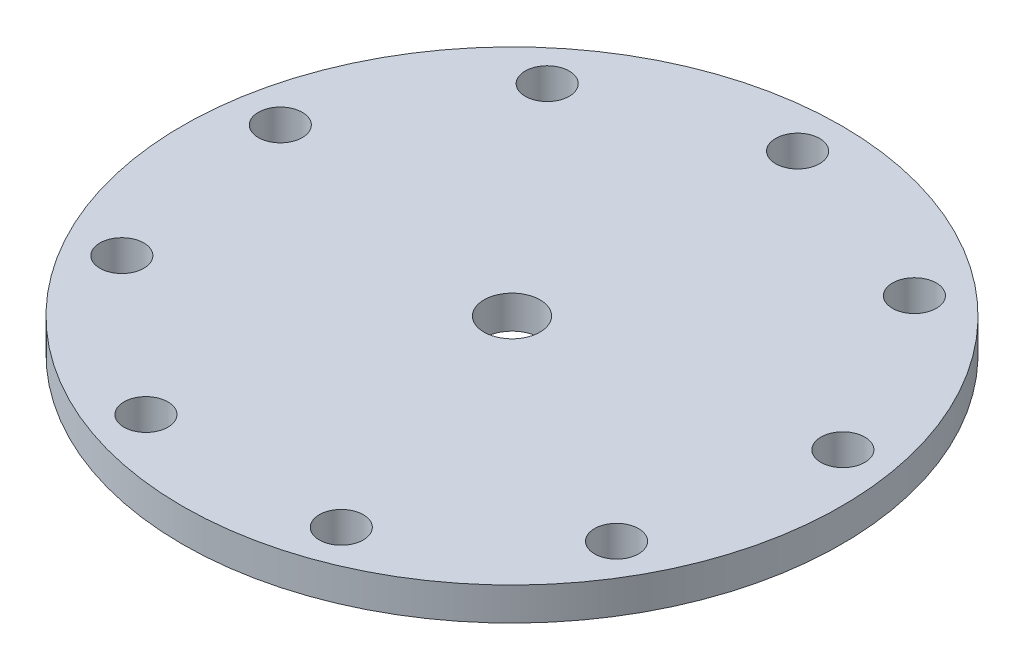
ISO-10303-21;
HEADER;
FILE_DESCRIPTION(('STEP AP214'),'2;1');
FILE_NAME('part.step','',(''),(''),'','','');
FILE_SCHEMA(('AUTOMOTIVE_DESIGN { 1 0 10303 214 1 1 1 1 }'));
ENDSEC;
DATA;
#1=APPLICATION_CONTEXT('core data for automotive mechanical design processes');
#2=APPLICATION_PROTOCOL_DEFINITION('international standard','automotive_design',2000,#1);
#3=PRODUCT_CONTEXT('',#1,'mechanical');
#4=PRODUCT('Part','Part','',(#3));
#5=PRODUCT_RELATED_PRODUCT_CATEGORY('part','',(#4));
#6=PRODUCT_DEFINITION_FORMATION('','',#4);
#7=PRODUCT_DEFINITION_CONTEXT('part definition',#1,'design');
#8=PRODUCT_DEFINITION('design','',#6,#7);
#9=PRODUCT_DEFINITION_SHAPE('','',#8);
#10=(LENGTH_UNIT() NAMED_UNIT(*) SI_UNIT(.MILLI.,.METRE.));
#11=(NAMED_UNIT(*) PLANE_ANGLE_UNIT() SI_UNIT($,.RADIAN.));
#12=(NAMED_UNIT(*) SI_UNIT($,.STERADIAN.) SOLID_ANGLE_UNIT());
#13=UNCERTAINTY_MEASURE_WITH_UNIT(LENGTH_MEASURE(1.E-05),#10,'distance_accuracy_value','');
#14=(GEOMETRIC_REPRESENTATION_CONTEXT(3) GLOBAL_UNCERTAINTY_ASSIGNED_CONTEXT((#13)) GLOBAL_UNIT_ASSIGNED_CONTEXT((#10,
#11,#12)) REPRESENTATION_CONTEXT('',''));
#15=CARTESIAN_POINT('',(0.,0.,0.));
#16=DIRECTION('',(0.,0.,1.));
#17=DIRECTION('',(1.,0.,0.));
#18=AXIS2_PLACEMENT_3D('',#15,#16,#17);
#19=CARTESIAN_POINT('',(0.,6.,0.));
#20=DIRECTION('',(0.,1.,0.));
#21=DIRECTION('',(0.,0.,1.));
#22=AXIS2_PLACEMENT_3D('',#19,#20,#21);
#23=PLANE('',#22);
#24=CARTESIAN_POINT('',(-51.210003156633,6.,-9.02970523867819));
#25=DIRECTION('',(0.,1.,0.));
#26=DIRECTION('',(0.,0.,1.));
#27=AXIS2_PLACEMENT_3D('',#24,#25,#26);
#28=CIRCLE('',#27,4.00000000000291);
#29=CARTESIAN_POINT('',(-51.210003156633,6.,-5.02970523867527));
#30=VERTEX_POINT('',#29);
#31=EDGE_CURVE('E91',#30,#30,#28,.T.);
#32=ORIENTED_EDGE('',*,*,#31,.F.);
#33=EDGE_LOOP('',(#32));
#34=FACE_BOUND('',#33,.T.);
#35=CARTESIAN_POINT('',(-17.7850474529305,6.,48.864016280868));
#36=DIRECTION('',(0.,1.,0.));
#37=DIRECTION('',(0.,0.,1.));
#38=AXIS2_PLACEMENT_3D('',#35,#36,#37);
#39=CIRCLE('',#38,4.00000000000469);
#40=CARTESIAN_POINT('',(-17.7850474529305,6.,52.8640162808727));
#41=VERTEX_POINT('',#40);
#42=EDGE_CURVE('E79',#41,#41,#39,.T.);
#43=ORIENTED_EDGE('',*,*,#42,.F.);
#44=EDGE_LOOP('',(#43));
#45=FACE_BOUND('',#44,.T.);
#46=CARTESIAN_POINT('',(45.0333209967941,6.,25.9999999999981));
#47=DIRECTION('',(0.,1.,0.));
#48=DIRECTION('',(0.,0.,1.));
#49=AXIS2_PLACEMENT_3D('',#46,#47,#48);
#50=CIRCLE('',#49,4.00000000000285);
#51=CARTESIAN_POINT('',(45.0333209967941,6.,30.0000000000009));
#52=VERTEX_POINT('',#51);
#53=EDGE_CURVE('E67',#52,#52,#50,.T.);
#54=ORIENTED_EDGE('',*,*,#53,.F.);
#55=EDGE_LOOP('',(#54));
#56=FACE_BOUND('',#55,.T.);
#57=CARTESIAN_POINT('',(33.4249557037006,6.,-39.8343110421883));
#58=DIRECTION('',(0.,1.,0.));
#59=DIRECTION('',(0.,0.,1.));
#60=AXIS2_PLACEMENT_3D('',#57,#58,#59);
#61=CIRCLE('',#60,4.00000000000017);
#62=CARTESIAN_POINT('',(33.4249557037006,6.,-35.8343110421881));
#63=VERTEX_POINT('',#62);
#64=EDGE_CURVE('E55',#63,#63,#61,.T.);
#65=ORIENTED_EDGE('',*,*,#64,.F.);
#66=EDGE_LOOP('',(#65));
#67=FACE_BOUND('',#66,.T.);
#68=CARTESIAN_POINT('',(0.,6.,-52.));
#69=DIRECTION('',(0.,1.,0.));
#70=DIRECTION('',(0.,0.,1.));
#71=AXIS2_PLACEMENT_3D('',#68,#69,#70);
#72=CIRCLE('',#71,4.);
#73=CARTESIAN_POINT('',(0.,6.,-48.));
#74=VERTEX_POINT('',#73);
#75=EDGE_CURVE('E44',#74,#74,#72,.T.);
#76=ORIENTED_EDGE('',*,*,#75,.F.);
#77=EDGE_LOOP('',(#76));
#78=FACE_BOUND('',#77,.T.);
#79=CARTESIAN_POINT('',(0.,6.,0.));
#80=DIRECTION('',(0.,1.,0.));
#81=DIRECTION('',(0.,0.,1.));
#82=AXIS2_PLACEMENT_3D('',#79,#80,#81);
#83=CIRCLE('',#82,60.);
#84=CARTESIAN_POINT('',(0.,6.,60.));
#85=VERTEX_POINT('',#84);
#86=EDGE_CURVE('E10',#85,#85,#83,.T.);
#87=ORIENTED_EDGE('',*,*,#86,.T.);
#88=EDGE_LOOP('',(#87));
#89=FACE_BOUND('',#88,.T.);
#90=CARTESIAN_POINT('',(0.,6.,0.));
#91=DIRECTION('',(0.,1.,0.));
#92=DIRECTION('',(0.,0.,1.));
#93=AXIS2_PLACEMENT_3D('',#90,#91,#92);
#94=CIRCLE('',#93,5.1);
#95=CARTESIAN_POINT('',(0.,6.,5.1));
#96=VERTEX_POINT('',#95);
#97=EDGE_CURVE('E49',#96,#96,#94,.T.);
#98=ORIENTED_EDGE('',*,*,#97,.F.);
#99=EDGE_LOOP('',(#98));
#100=FACE_BOUND('',#99,.T.);
#101=CARTESIAN_POINT('',(51.2100031566366,6.,-9.02970523868255));
#102=DIRECTION('',(0.,1.,0.));
#103=DIRECTION('',(0.,0.,1.));
#104=AXIS2_PLACEMENT_3D('',#101,#102,#103);
#105=CIRCLE('',#104,4.00000000000126);
#106=CARTESIAN_POINT('',(51.2100031566366,6.,-5.02970523868129));
#107=VERTEX_POINT('',#106);
#108=EDGE_CURVE('E61',#107,#107,#105,.T.);
#109=ORIENTED_EDGE('',*,*,#108,.F.);
#110=EDGE_LOOP('',(#109));
#111=FACE_BOUND('',#110,.T.);
#112=CARTESIAN_POINT('',(17.7850474529391,6.,48.8640162808665));
#113=DIRECTION('',(0.,1.,0.));
#114=DIRECTION('',(0.,0.,1.));
#115=AXIS2_PLACEMENT_3D('',#112,#113,#114);
#116=CIRCLE('',#115,4.00000000000419);
#117=CARTESIAN_POINT('',(17.7850474529391,6.,52.8640162808707));
#118=VERTEX_POINT('',#117);
#119=EDGE_CURVE('E73',#118,#118,#116,.T.);
#120=ORIENTED_EDGE('',*,*,#119,.F.);
#121=EDGE_LOOP('',(#120));
#122=FACE_BOUND('',#121,.T.);
#123=CARTESIAN_POINT('',(-45.0333209967875,6.,26.0000000000019));
#124=DIRECTION('',(0.,1.,0.));
#125=DIRECTION('',(0.,0.,1.));
#126=AXIS2_PLACEMENT_3D('',#123,#124,#125);
#127=CIRCLE('',#126,4.00000000000419);
#128=CARTESIAN_POINT('',(-45.0333209967875,6.,30.0000000000061));
#129=VERTEX_POINT('',#128);
#130=EDGE_CURVE('E85',#129,#129,#127,.T.);
#131=ORIENTED_EDGE('',*,*,#130,.F.);
#132=EDGE_LOOP('',(#131));
#133=FACE_BOUND('',#132,.T.);
#134=CARTESIAN_POINT('',(-33.4249557036995,6.,-39.8343110421854));
#135=DIRECTION('',(0.,1.,0.));
#136=DIRECTION('',(0.,0.,1.));
#137=AXIS2_PLACEMENT_3D('',#134,#135,#136);
#138=CIRCLE('',#137,4.00000000000153);
#139=CARTESIAN_POINT('',(-33.4249557036995,6.,-35.8343110421839));
#140=VERTEX_POINT('',#139);
#141=EDGE_CURVE('E97',#140,#140,#138,.T.);
#142=ORIENTED_EDGE('',*,*,#141,.F.);
#143=EDGE_LOOP('',(#142));
#144=FACE_BOUND('',#143,.T.);
#145=ADVANCED_FACE('F33',(#34,#45,#56,#67,#78,#89,#100,#111,#122,#133,#144),#23,.T.);
#146=CARTESIAN_POINT('',(0.,0.,0.));
#147=DIRECTION('',(0.,1.,0.));
#148=DIRECTION('',(0.,0.,1.));
#149=AXIS2_PLACEMENT_3D('',#146,#147,#148);
#150=PLANE('',#149);
#151=CARTESIAN_POINT('',(0.,0.,0.));
#152=DIRECTION('',(0.,1.,0.));
#153=DIRECTION('',(0.,0.,1.));
#154=AXIS2_PLACEMENT_3D('',#151,#152,#153);
#155=CIRCLE('',#154,60.);
#156=CARTESIAN_POINT('',(0.,0.,60.));
#157=VERTEX_POINT('',#156);
#158=EDGE_CURVE('E37',#157,#157,#155,.T.);
#159=ORIENTED_EDGE('',*,*,#158,.F.);
#160=EDGE_LOOP('',(#159));
#161=FACE_BOUND('',#160,.T.);
#162=CARTESIAN_POINT('',(0.,0.,-52.));
#163=DIRECTION('',(0.,1.,0.));
#164=DIRECTION('',(0.,0.,1.));
#165=AXIS2_PLACEMENT_3D('',#162,#163,#164);
#166=CIRCLE('',#165,4.);
#167=CARTESIAN_POINT('',(0.,0.,-48.));
#168=VERTEX_POINT('',#167);
#169=EDGE_CURVE('E46',#168,#168,#166,.T.);
#170=ORIENTED_EDGE('',*,*,#169,.T.);
#171=EDGE_LOOP('',(#170));
#172=FACE_BOUND('',#171,.T.);
#173=CARTESIAN_POINT('',(0.,0.,0.));
#174=DIRECTION('',(0.,1.,0.));
#175=DIRECTION('',(0.,0.,1.));
#176=AXIS2_PLACEMENT_3D('',#173,#174,#175);
#177=CIRCLE('',#176,5.1);
#178=CARTESIAN_POINT('',(0.,0.,5.1));
#179=VERTEX_POINT('',#178);
#180=EDGE_CURVE('E52',#179,#179,#177,.T.);
#181=ORIENTED_EDGE('',*,*,#180,.T.);
#182=EDGE_LOOP('',(#181));
#183=FACE_BOUND('',#182,.T.);
#184=CARTESIAN_POINT('',(33.4249557037006,0.,-39.8343110421883));
#185=DIRECTION('',(0.,1.,0.));
#186=DIRECTION('',(0.,0.,1.));
#187=AXIS2_PLACEMENT_3D('',#184,#185,#186);
#188=CIRCLE('',#187,4.00000000000017);
#189=CARTESIAN_POINT('',(33.4249557037006,0.,-35.8343110421881));
#190=VERTEX_POINT('',#189);
#191=EDGE_CURVE('E58',#190,#190,#188,.T.);
#192=ORIENTED_EDGE('',*,*,#191,.T.);
#193=EDGE_LOOP('',(#192));
#194=FACE_BOUND('',#193,.T.);
#195=CARTESIAN_POINT('',(51.2100031566366,0.,-9.02970523868255));
#196=DIRECTION('',(0.,1.,0.));
#197=DIRECTION('',(0.,0.,1.));
#198=AXIS2_PLACEMENT_3D('',#195,#196,#197);
#199=CIRCLE('',#198,4.00000000000126);
#200=CARTESIAN_POINT('',(51.2100031566366,0.,-5.02970523868129));
#201=VERTEX_POINT('',#200);
#202=EDGE_CURVE('E64',#201,#201,#199,.T.);
#203=ORIENTED_EDGE('',*,*,#202,.T.);
#204=EDGE_LOOP('',(#203));
#205=FACE_BOUND('',#204,.T.);
#206=CARTESIAN_POINT('',(45.0333209967941,0.,25.9999999999981));
#207=DIRECTION('',(0.,1.,0.));
#208=DIRECTION('',(0.,0.,1.));
#209=AXIS2_PLACEMENT_3D('',#206,#207,#208);
#210=CIRCLE('',#209,4.00000000000285);
#211=CARTESIAN_POINT('',(45.0333209967941,0.,30.0000000000009));
#212=VERTEX_POINT('',#211);
#213=EDGE_CURVE('E70',#212,#212,#210,.T.);
#214=ORIENTED_EDGE('',*,*,#213,.T.);
#215=EDGE_LOOP('',(#214));
#216=FACE_BOUND('',#215,.T.);
#217=CARTESIAN_POINT('',(17.7850474529391,0.,48.8640162808665));
#218=DIRECTION('',(0.,1.,0.));
#219=DIRECTION('',(0.,0.,1.));
#220=AXIS2_PLACEMENT_3D('',#217,#218,#219);
#221=CIRCLE('',#220,4.00000000000419);
#222=CARTESIAN_POINT('',(17.7850474529391,0.,52.8640162808707));
#223=VERTEX_POINT('',#222);
#224=EDGE_CURVE('E76',#223,#223,#221,.T.);
#225=ORIENTED_EDGE('',*,*,#224,.T.);
#226=EDGE_LOOP('',(#225));
#227=FACE_BOUND('',#226,.T.);
#228=CARTESIAN_POINT('',(-17.7850474529305,0.,48.864016280868));
#229=DIRECTION('',(0.,1.,0.));
#230=DIRECTION('',(0.,0.,1.));
#231=AXIS2_PLACEMENT_3D('',#228,#229,#230);
#232=CIRCLE('',#231,4.00000000000469);
#233=CARTESIAN_POINT('',(-17.7850474529305,0.,52.8640162808727));
#234=VERTEX_POINT('',#233);
#235=EDGE_CURVE('E82',#234,#234,#232,.T.);
#236=ORIENTED_EDGE('',*,*,#235,.T.);
#237=EDGE_LOOP('',(#236));
#238=FACE_BOUND('',#237,.T.);
#239=CARTESIAN_POINT('',(-45.0333209967875,0.,26.0000000000019));
#240=DIRECTION('',(0.,1.,0.));
#241=DIRECTION('',(0.,0.,1.));
#242=AXIS2_PLACEMENT_3D('',#239,#240,#241);
#243=CIRCLE('',#242,4.00000000000419);
#244=CARTESIAN_POINT('',(-45.0333209967875,0.,30.0000000000061));
#245=VERTEX_POINT('',#244);
#246=EDGE_CURVE('E88',#245,#245,#243,.T.);
#247=ORIENTED_EDGE('',*,*,#246,.T.);
#248=EDGE_LOOP('',(#247));
#249=FACE_BOUND('',#248,.T.);
#250=CARTESIAN_POINT('',(-51.210003156633,0.,-9.02970523867819));
#251=DIRECTION('',(0.,1.,0.));
#252=DIRECTION('',(0.,0.,1.));
#253=AXIS2_PLACEMENT_3D('',#250,#251,#252);
#254=CIRCLE('',#253,4.00000000000291);
#255=CARTESIAN_POINT('',(-51.210003156633,0.,-5.02970523867527));
#256=VERTEX_POINT('',#255);
#257=EDGE_CURVE('E94',#256,#256,#254,.T.);
#258=ORIENTED_EDGE('',*,*,#257,.T.);
#259=EDGE_LOOP('',(#258));
#260=FACE_BOUND('',#259,.T.);
#261=CARTESIAN_POINT('',(-33.4249557036995,0.,-39.8343110421854));
#262=DIRECTION('',(0.,1.,0.));
#263=DIRECTION('',(0.,0.,1.));
#264=AXIS2_PLACEMENT_3D('',#261,#262,#263);
#265=CIRCLE('',#264,4.00000000000153);
#266=CARTESIAN_POINT('',(-33.4249557036995,0.,-35.8343110421839));
#267=VERTEX_POINT('',#266);
#268=EDGE_CURVE('E100',#267,#267,#265,.T.);
#269=ORIENTED_EDGE('',*,*,#268,.T.);
#270=EDGE_LOOP('',(#269));
#271=FACE_BOUND('',#270,.T.);
#272=ADVANCED_FACE('F110',(#161,#172,#183,#194,#205,#216,#227,#238,#249,#260,#271),#150,.F.);
#273=CARTESIAN_POINT('',(0.,6.,0.));
#274=DIRECTION('',(0.,-1.,0.));
#275=DIRECTION('',(0.,0.,-1.));
#276=AXIS2_PLACEMENT_3D('',#273,#274,#275);
#277=CYLINDRICAL_SURFACE('',#276,60.);
#278=ORIENTED_EDGE('',*,*,#86,.F.);
#279=EDGE_LOOP('',(#278));
#280=FACE_BOUND('',#279,.T.);
#281=ORIENTED_EDGE('',*,*,#158,.T.);
#282=EDGE_LOOP('',(#281));
#283=FACE_BOUND('',#282,.T.);
#284=ADVANCED_FACE('F35',(#280,#283),#277,.T.);
#285=CARTESIAN_POINT('',(0.,6.,-52.));
#286=DIRECTION('',(0.,-1.,0.));
#287=DIRECTION('',(0.,0.,-1.));
#288=AXIS2_PLACEMENT_3D('',#285,#286,#287);
#289=CYLINDRICAL_SURFACE('',#288,4.);
#290=ORIENTED_EDGE('',*,*,#75,.T.);
#291=EDGE_LOOP('',(#290));
#292=FACE_BOUND('',#291,.T.);
#293=ORIENTED_EDGE('',*,*,#169,.F.);
#294=EDGE_LOOP('',(#293));
#295=FACE_BOUND('',#294,.T.);
#296=ADVANCED_FACE('F120',(#292,#295),#289,.F.);
#297=CARTESIAN_POINT('',(0.,6.,0.));
#298=DIRECTION('',(0.,-1.,0.));
#299=DIRECTION('',(0.,0.,-1.));
#300=AXIS2_PLACEMENT_3D('',#297,#298,#299);
#301=CYLINDRICAL_SURFACE('',#300,5.1);
#302=ORIENTED_EDGE('',*,*,#97,.T.);
#303=EDGE_LOOP('',(#302));
#304=FACE_BOUND('',#303,.T.);
#305=ORIENTED_EDGE('',*,*,#180,.F.);
#306=EDGE_LOOP('',(#305));
#307=FACE_BOUND('',#306,.T.);
#308=ADVANCED_FACE('F123',(#304,#307),#301,.F.);
#309=CARTESIAN_POINT('',(33.4249557037006,6.,-39.8343110421883));
#310=DIRECTION('',(0.,-1.,0.));
#311=DIRECTION('',(0.,0.,-1.));
#312=AXIS2_PLACEMENT_3D('',#309,#310,#311);
#313=CYLINDRICAL_SURFACE('',#312,4.00000000000017);
#314=ORIENTED_EDGE('',*,*,#64,.T.);
#315=EDGE_LOOP('',(#314));
#316=FACE_BOUND('',#315,.T.);
#317=ORIENTED_EDGE('',*,*,#191,.F.);
#318=EDGE_LOOP('',(#317));
#319=FACE_BOUND('',#318,.T.);
#320=ADVANCED_FACE('F127',(#316,#319),#313,.F.);
#321=CARTESIAN_POINT('',(51.2100031566366,6.,-9.02970523868255));
#322=DIRECTION('',(0.,-1.,0.));
#323=DIRECTION('',(0.,0.,-1.));
#324=AXIS2_PLACEMENT_3D('',#321,#322,#323);
#325=CYLINDRICAL_SURFACE('',#324,4.00000000000126);
#326=ORIENTED_EDGE('',*,*,#108,.T.);
#327=EDGE_LOOP('',(#326));
#328=FACE_BOUND('',#327,.T.);
#329=ORIENTED_EDGE('',*,*,#202,.F.);
#330=EDGE_LOOP('',(#329));
#331=FACE_BOUND('',#330,.T.);
#332=ADVANCED_FACE('F131',(#328,#331),#325,.F.);
#333=CARTESIAN_POINT('',(45.0333209967941,6.,25.9999999999981));
#334=DIRECTION('',(0.,-1.,0.));
#335=DIRECTION('',(0.,0.,-1.));
#336=AXIS2_PLACEMENT_3D('',#333,#334,#335);
#337=CYLINDRICAL_SURFACE('',#336,4.00000000000285);
#338=ORIENTED_EDGE('',*,*,#53,.T.);
#339=EDGE_LOOP('',(#338));
#340=FACE_BOUND('',#339,.T.);
#341=ORIENTED_EDGE('',*,*,#213,.F.);
#342=EDGE_LOOP('',(#341));
#343=FACE_BOUND('',#342,.T.);
#344=ADVANCED_FACE('F135',(#340,#343),#337,.F.);
#345=CARTESIAN_POINT('',(17.7850474529391,6.,48.8640162808665));
#346=DIRECTION('',(0.,-1.,0.));
#347=DIRECTION('',(0.,0.,-1.));
#348=AXIS2_PLACEMENT_3D('',#345,#346,#347);
#349=CYLINDRICAL_SURFACE('',#348,4.00000000000419);
#350=ORIENTED_EDGE('',*,*,#119,.T.);
#351=EDGE_LOOP('',(#350));
#352=FACE_BOUND('',#351,.T.);
#353=ORIENTED_EDGE('',*,*,#224,.F.);
#354=EDGE_LOOP('',(#353));
#355=FACE_BOUND('',#354,.T.);
#356=ADVANCED_FACE('F139',(#352,#355),#349,.F.);
#357=CARTESIAN_POINT('',(-17.7850474529305,6.,48.864016280868));
#358=DIRECTION('',(0.,-1.,0.));
#359=DIRECTION('',(0.,0.,-1.));
#360=AXIS2_PLACEMENT_3D('',#357,#358,#359);
#361=CYLINDRICAL_SURFACE('',#360,4.00000000000469);
#362=ORIENTED_EDGE('',*,*,#42,.T.);
#363=EDGE_LOOP('',(#362));
#364=FACE_BOUND('',#363,.T.);
#365=ORIENTED_EDGE('',*,*,#235,.F.);
#366=EDGE_LOOP('',(#365));
#367=FACE_BOUND('',#366,.T.);
#368=ADVANCED_FACE('F143',(#364,#367),#361,.F.);
#369=CARTESIAN_POINT('',(-45.0333209967875,6.,26.0000000000019));
#370=DIRECTION('',(0.,-1.,0.));
#371=DIRECTION('',(0.,0.,-1.));
#372=AXIS2_PLACEMENT_3D('',#369,#370,#371);
#373=CYLINDRICAL_SURFACE('',#372,4.00000000000419);
#374=ORIENTED_EDGE('',*,*,#130,.T.);
#375=EDGE_LOOP('',(#374));
#376=FACE_BOUND('',#375,.T.);
#377=ORIENTED_EDGE('',*,*,#246,.F.);
#378=EDGE_LOOP('',(#377));
#379=FACE_BOUND('',#378,.T.);
#380=ADVANCED_FACE('F147',(#376,#379),#373,.F.);
#381=CARTESIAN_POINT('',(-51.210003156633,6.,-9.02970523867819));
#382=DIRECTION('',(0.,-1.,0.));
#383=DIRECTION('',(0.,0.,-1.));
#384=AXIS2_PLACEMENT_3D('',#381,#382,#383);
#385=CYLINDRICAL_SURFACE('',#384,4.00000000000291);
#386=ORIENTED_EDGE('',*,*,#31,.T.);
#387=EDGE_LOOP('',(#386));
#388=FACE_BOUND('',#387,.T.);
#389=ORIENTED_EDGE('',*,*,#257,.F.);
#390=EDGE_LOOP('',(#389));
#391=FACE_BOUND('',#390,.T.);
#392=ADVANCED_FACE('F151',(#388,#391),#385,.F.);
#393=CARTESIAN_POINT('',(-33.4249557036995,6.,-39.8343110421854));
#394=DIRECTION('',(0.,-1.,0.));
#395=DIRECTION('',(0.,0.,-1.));
#396=AXIS2_PLACEMENT_3D('',#393,#394,#395);
#397=CYLINDRICAL_SURFACE('',#396,4.00000000000153);
#398=ORIENTED_EDGE('',*,*,#141,.T.);
#399=EDGE_LOOP('',(#398));
#400=FACE_BOUND('',#399,.T.);
#401=ORIENTED_EDGE('',*,*,#268,.F.);
#402=EDGE_LOOP('',(#401));
#403=FACE_BOUND('',#402,.T.);
#404=ADVANCED_FACE('F106',(#400,#403),#397,.F.);
#405=CLOSED_SHELL('',(#145,#272,#284,#296,#308,#320,#332,#344,#356,#368,#380,#392,#404));
#406=MANIFOLD_SOLID_BREP('B2',#405);
#407=ADVANCED_BREP_SHAPE_REPRESENTATION('',(#18,#406),#14);
#408=SHAPE_DEFINITION_REPRESENTATION(#9,#407);
ENDSEC;
END-ISO-10303-21;
